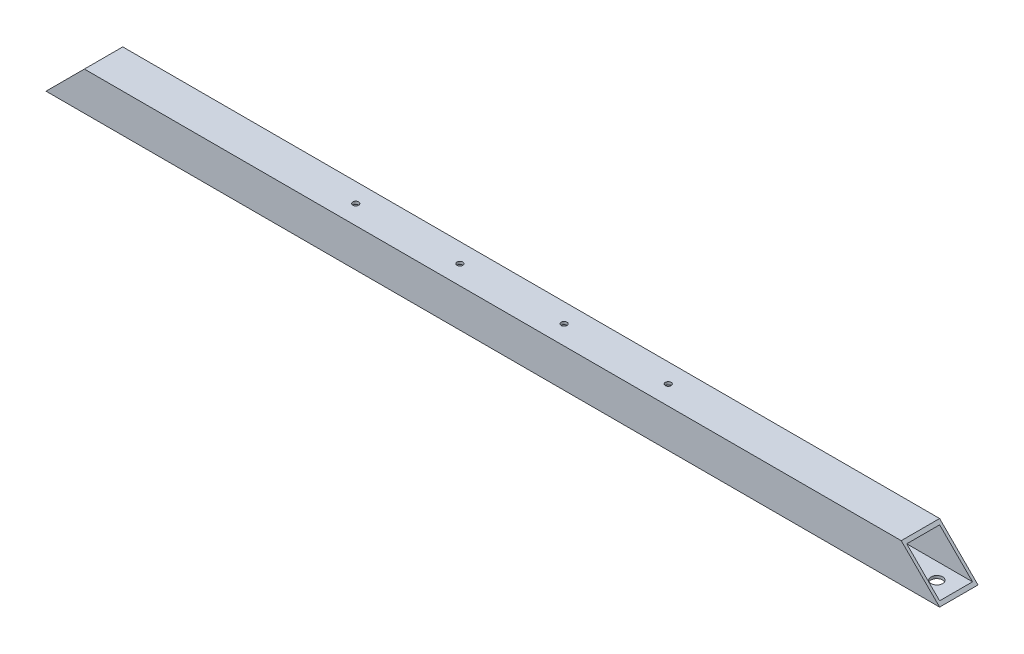
ISO-10303-21;
HEADER;
FILE_DESCRIPTION(('STEP AP214'),'2;1');
FILE_NAME('part.step','',(''),(''),'','','');
FILE_SCHEMA(('AUTOMOTIVE_DESIGN { 1 0 10303 214 1 1 1 1 }'));
ENDSEC;
DATA;
#1=APPLICATION_CONTEXT('core data for automotive mechanical design processes');
#2=APPLICATION_PROTOCOL_DEFINITION('international standard','automotive_design',2000,#1);
#3=PRODUCT_CONTEXT('',#1,'mechanical');
#4=PRODUCT('Part','Part','',(#3));
#5=PRODUCT_RELATED_PRODUCT_CATEGORY('part','',(#4));
#6=PRODUCT_DEFINITION_FORMATION('','',#4);
#7=PRODUCT_DEFINITION_CONTEXT('part definition',#1,'design');
#8=PRODUCT_DEFINITION('design','',#6,#7);
#9=PRODUCT_DEFINITION_SHAPE('','',#8);
#10=(LENGTH_UNIT() NAMED_UNIT(*) SI_UNIT(.MILLI.,.METRE.));
#11=(NAMED_UNIT(*) PLANE_ANGLE_UNIT() SI_UNIT($,.RADIAN.));
#12=(NAMED_UNIT(*) SI_UNIT($,.STERADIAN.) SOLID_ANGLE_UNIT());
#13=UNCERTAINTY_MEASURE_WITH_UNIT(LENGTH_MEASURE(1.E-05),#10,'distance_accuracy_value','');
#14=(GEOMETRIC_REPRESENTATION_CONTEXT(3) GLOBAL_UNCERTAINTY_ASSIGNED_CONTEXT((#13)) GLOBAL_UNIT_ASSIGNED_CONTEXT((#10,
#11,#12)) REPRESENTATION_CONTEXT('',''));
#15=CARTESIAN_POINT('',(0.,0.,0.));
#16=DIRECTION('',(0.,0.,1.));
#17=DIRECTION('',(1.,0.,0.));
#18=AXIS2_PLACEMENT_3D('',#15,#16,#17);
#19=CARTESIAN_POINT('',(1035.05,22.225,22.225));
#20=DIRECTION('',(0.,-1.,0.));
#21=DIRECTION('',(0.,0.,-1.));
#22=AXIS2_PLACEMENT_3D('',#19,#20,#21);
#23=PLANE('',#22);
#24=CARTESIAN_POINT('',(336.55,22.225,0.));
#25=DIRECTION('',(0.,1.,0.));
#26=DIRECTION('',(0.,0.,1.));
#27=AXIS2_PLACEMENT_3D('',#24,#25,#26);
#28=CIRCLE('',#27,3.3782);
#29=CARTESIAN_POINT('',(336.55,22.225,3.37820000000008));
#30=VERTEX_POINT('',#29);
#31=EDGE_CURVE('E453',#30,#30,#28,.T.);
#32=ORIENTED_EDGE('',*,*,#31,.F.);
#33=EDGE_LOOP('',(#32));
#34=FACE_BOUND('',#33,.T.);
#35=CARTESIAN_POINT('',(457.2,22.225,0.));
#36=DIRECTION('',(0.,1.,0.));
#37=DIRECTION('',(0.,0.,1.));
#38=AXIS2_PLACEMENT_3D('',#35,#36,#37);
#39=CIRCLE('',#38,3.3782);
#40=CARTESIAN_POINT('',(457.2,22.225,3.37820000000006));
#41=VERTEX_POINT('',#40);
#42=EDGE_CURVE('E156',#41,#41,#39,.T.);
#43=ORIENTED_EDGE('',*,*,#42,.F.);
#44=EDGE_LOOP('',(#43));
#45=FACE_BOUND('',#44,.T.);
#46=CARTESIAN_POINT('',(698.5,22.225,0.));
#47=DIRECTION('',(0.,1.,0.));
#48=DIRECTION('',(0.,0.,1.));
#49=AXIS2_PLACEMENT_3D('',#46,#47,#48);
#50=CIRCLE('',#49,3.3782);
#51=CARTESIAN_POINT('',(698.5,22.225,3.37820000000008));
#52=VERTEX_POINT('',#51);
#53=EDGE_CURVE('E180',#52,#52,#50,.T.);
#54=ORIENTED_EDGE('',*,*,#53,.F.);
#55=EDGE_LOOP('',(#54));
#56=FACE_BOUND('',#55,.T.);
#57=DIRECTION('',(-1.,0.,0.));
#58=VECTOR('',#57,1.);
#59=CARTESIAN_POINT('',(1035.05,22.225,-22.225));
#60=LINE('',#59,#58);
#61=CARTESIAN_POINT('',(990.6,22.225,-22.225));
#62=VERTEX_POINT('',#61);
#63=CARTESIAN_POINT('',(44.45,22.225,-22.225));
#64=VERTEX_POINT('',#63);
#65=EDGE_CURVE('E120',#62,#64,#60,.T.);
#66=ORIENTED_EDGE('',*,*,#65,.T.);
#67=DIRECTION('',(0.,0.,1.));
#68=VECTOR('',#67,1.);
#69=CARTESIAN_POINT('',(44.45,22.225,-22.225));
#70=LINE('',#69,#68);
#71=CARTESIAN_POINT('',(44.45,22.225,22.225));
#72=VERTEX_POINT('',#71);
#73=EDGE_CURVE('E103',#64,#72,#70,.T.);
#74=ORIENTED_EDGE('',*,*,#73,.T.);
#75=DIRECTION('',(-1.,0.,0.));
#76=VECTOR('',#75,1.);
#77=CARTESIAN_POINT('',(1035.05,22.225,22.225));
#78=LINE('',#77,#76);
#79=CARTESIAN_POINT('',(990.6,22.225,22.225));
#80=VERTEX_POINT('',#79);
#81=EDGE_CURVE('E128',#80,#72,#78,.T.);
#82=ORIENTED_EDGE('',*,*,#81,.F.);
#83=DIRECTION('',(0.,0.,1.));
#84=VECTOR('',#83,1.);
#85=CARTESIAN_POINT('',(990.6,22.225,-22.225));
#86=LINE('',#85,#84);
#87=EDGE_CURVE('E126',#62,#80,#86,.T.);
#88=ORIENTED_EDGE('',*,*,#87,.F.);
#89=EDGE_LOOP('',(#66,#74,#82,#88));
#90=FACE_BOUND('',#89,.T.);
#91=CARTESIAN_POINT('',(577.85,22.225,0.));
#92=DIRECTION('',(0.,1.,0.));
#93=DIRECTION('',(0.,0.,1.));
#94=AXIS2_PLACEMENT_3D('',#91,#92,#93);
#95=CIRCLE('',#94,3.3782);
#96=CARTESIAN_POINT('',(577.85,22.225,3.37820000000006));
#97=VERTEX_POINT('',#96);
#98=EDGE_CURVE('E152',#97,#97,#95,.T.);
#99=ORIENTED_EDGE('',*,*,#98,.F.);
#100=EDGE_LOOP('',(#99));
#101=FACE_BOUND('',#100,.T.);
#102=ADVANCED_FACE('F38',(#34,#45,#56,#90,#101),#23,.F.);
#103=CARTESIAN_POINT('',(1035.05,-22.225,22.225));
#104=DIRECTION('',(0.,1.,0.));
#105=DIRECTION('',(0.,0.,1.));
#106=AXIS2_PLACEMENT_3D('',#103,#104,#105);
#107=PLANE('',#106);
#108=CARTESIAN_POINT('',(336.55,-22.225,0.));
#109=DIRECTION('',(0.,1.,0.));
#110=DIRECTION('',(0.,0.,1.));
#111=AXIS2_PLACEMENT_3D('',#108,#109,#110);
#112=CIRCLE('',#111,3.3782);
#113=CARTESIAN_POINT('',(336.55,-22.225,3.37820000000008));
#114=VERTEX_POINT('',#113);
#115=EDGE_CURVE('E454',#114,#114,#112,.T.);
#116=ORIENTED_EDGE('',*,*,#115,.T.);
#117=EDGE_LOOP('',(#116));
#118=FACE_BOUND('',#117,.T.);
#119=CARTESIAN_POINT('',(457.2,-22.225,0.));
#120=DIRECTION('',(0.,1.,0.));
#121=DIRECTION('',(0.,0.,1.));
#122=AXIS2_PLACEMENT_3D('',#119,#120,#121);
#123=CIRCLE('',#122,3.3782);
#124=CARTESIAN_POINT('',(457.2,-22.225,3.37820000000006));
#125=VERTEX_POINT('',#124);
#126=EDGE_CURVE('E145',#125,#125,#123,.T.);
#127=ORIENTED_EDGE('',*,*,#126,.T.);
#128=EDGE_LOOP('',(#127));
#129=FACE_BOUND('',#128,.T.);
#130=CARTESIAN_POINT('',(577.85,-22.225,0.));
#131=DIRECTION('',(0.,1.,0.));
#132=DIRECTION('',(0.,0.,1.));
#133=AXIS2_PLACEMENT_3D('',#130,#131,#132);
#134=CIRCLE('',#133,3.3782);
#135=CARTESIAN_POINT('',(577.85,-22.225,3.37820000000006));
#136=VERTEX_POINT('',#135);
#137=EDGE_CURVE('E169',#136,#136,#134,.T.);
#138=ORIENTED_EDGE('',*,*,#137,.T.);
#139=EDGE_LOOP('',(#138));
#140=FACE_BOUND('',#139,.T.);
#141=CARTESIAN_POINT('',(698.5,-22.225,0.));
#142=DIRECTION('',(0.,1.,0.));
#143=DIRECTION('',(0.,0.,1.));
#144=AXIS2_PLACEMENT_3D('',#141,#142,#143);
#145=CIRCLE('',#144,3.3782);
#146=CARTESIAN_POINT('',(698.5,-22.225,3.37820000000008));
#147=VERTEX_POINT('',#146);
#148=EDGE_CURVE('E183',#147,#147,#145,.T.);
#149=ORIENTED_EDGE('',*,*,#148,.T.);
#150=EDGE_LOOP('',(#149));
#151=FACE_BOUND('',#150,.T.);
#152=CARTESIAN_POINT('',(25.4,-22.225,0.));
#153=DIRECTION('',(0.,-1.,0.));
#154=DIRECTION('',(0.,0.,-1.));
#155=AXIS2_PLACEMENT_3D('',#152,#153,#154);
#156=CIRCLE('',#155,6.74624);
#157=CARTESIAN_POINT('',(25.4,-22.225,-6.74623999999999));
#158=VERTEX_POINT('',#157);
#159=EDGE_CURVE('E140',#158,#158,#156,.T.);
#160=ORIENTED_EDGE('',*,*,#159,.F.);
#161=EDGE_LOOP('',(#160));
#162=FACE_BOUND('',#161,.T.);
#163=DIRECTION('',(0.,0.,-1.));
#164=VECTOR('',#163,1.);
#165=CARTESIAN_POINT('',(0.,-22.225,22.225));
#166=LINE('',#165,#164);
#167=CARTESIAN_POINT('',(0.,-22.225,22.225));
#168=VERTEX_POINT('',#167);
#169=CARTESIAN_POINT('',(0.,-22.225,-22.225));
#170=VERTEX_POINT('',#169);
#171=EDGE_CURVE('E229',#168,#170,#166,.T.);
#172=ORIENTED_EDGE('',*,*,#171,.T.);
#173=DIRECTION('',(-1.,0.,0.));
#174=VECTOR('',#173,1.);
#175=CARTESIAN_POINT('',(1035.05,-22.225,-22.225));
#176=LINE('',#175,#174);
#177=CARTESIAN_POINT('',(1035.05,-22.225,-22.225));
#178=VERTEX_POINT('',#177);
#179=EDGE_CURVE('E122',#178,#170,#176,.T.);
#180=ORIENTED_EDGE('',*,*,#179,.F.);
#181=DIRECTION('',(0.,0.,-1.));
#182=VECTOR('',#181,1.);
#183=CARTESIAN_POINT('',(1035.05,-22.225,22.225));
#184=LINE('',#183,#182);
#185=CARTESIAN_POINT('',(1035.05,-22.225,22.225));
#186=VERTEX_POINT('',#185);
#187=EDGE_CURVE('E230',#186,#178,#184,.T.);
#188=ORIENTED_EDGE('',*,*,#187,.F.);
#189=DIRECTION('',(-1.,0.,0.));
#190=VECTOR('',#189,1.);
#191=CARTESIAN_POINT('',(1035.05,-22.225,22.225));
#192=LINE('',#191,#190);
#193=EDGE_CURVE('E133',#186,#168,#192,.T.);
#194=ORIENTED_EDGE('',*,*,#193,.T.);
#195=EDGE_LOOP('',(#172,#180,#188,#194));
#196=FACE_BOUND('',#195,.T.);
#197=CARTESIAN_POINT('',(1009.65,-22.225,1.24005308158032E-13));
#198=DIRECTION('',(0.,-1.,0.));
#199=DIRECTION('',(0.,0.,-1.));
#200=AXIS2_PLACEMENT_3D('',#197,#198,#199);
#201=CIRCLE('',#200,6.74624000000001);
#202=CARTESIAN_POINT('',(1009.65,-22.225,-6.74623999999989));
#203=VERTEX_POINT('',#202);
#204=EDGE_CURVE('E139',#203,#203,#201,.T.);
#205=ORIENTED_EDGE('',*,*,#204,.F.);
#206=EDGE_LOOP('',(#205));
#207=FACE_BOUND('',#206,.T.);
#208=ADVANCED_FACE('F238',(#118,#129,#140,#151,#162,#196,#207),#107,.F.);
#209=CARTESIAN_POINT('',(1035.05,-19.05,19.05));
#210=DIRECTION('',(0.,0.,-1.));
#211=DIRECTION('',(-1.,0.,0.));
#212=AXIS2_PLACEMENT_3D('',#209,#210,#211);
#213=PLANE('',#212);
#214=DIRECTION('',(-0.707106781186548,-0.707106781186548,0.));
#215=VECTOR('',#214,1.);
#216=CARTESIAN_POINT('',(519.1125,496.8875,19.05));
#217=LINE('',#216,#215);
#218=CARTESIAN_POINT('',(41.2750000000003,19.05,19.05));
#219=VERTEX_POINT('',#218);
#220=CARTESIAN_POINT('',(3.17500000000015,-19.05,19.05));
#221=VERTEX_POINT('',#220);
#222=EDGE_CURVE('E11',#219,#221,#217,.T.);
#223=ORIENTED_EDGE('',*,*,#222,.F.);
#224=DIRECTION('',(-1.,0.,0.));
#225=VECTOR('',#224,1.);
#226=CARTESIAN_POINT('',(1035.05,19.05,19.05));
#227=LINE('',#226,#225);
#228=CARTESIAN_POINT('',(993.775,19.05,19.05));
#229=VERTEX_POINT('',#228);
#230=EDGE_CURVE('E218',#229,#219,#227,.T.);
#231=ORIENTED_EDGE('',*,*,#230,.F.);
#232=DIRECTION('',(-0.707106781186547,0.707106781186548,0.));
#233=VECTOR('',#232,1.);
#234=CARTESIAN_POINT('',(1033.4625,-20.6375,19.05));
#235=LINE('',#234,#233);
#236=CARTESIAN_POINT('',(1031.875,-19.05,19.05));
#237=VERTEX_POINT('',#236);
#238=EDGE_CURVE('E47',#237,#229,#235,.T.);
#239=ORIENTED_EDGE('',*,*,#238,.F.);
#240=DIRECTION('',(-1.,0.,0.));
#241=VECTOR('',#240,1.);
#242=CARTESIAN_POINT('',(1035.05,-19.05,19.05));
#243=LINE('',#242,#241);
#244=EDGE_CURVE('E214',#237,#221,#243,.T.);
#245=ORIENTED_EDGE('',*,*,#244,.T.);
#246=EDGE_LOOP('',(#223,#231,#239,#245));
#247=FACE_BOUND('',#246,.T.);
#248=ADVANCED_FACE('F262',(#247),#213,.T.);
#249=CARTESIAN_POINT('',(1035.05,19.05,19.05));
#250=DIRECTION('',(0.,-1.,0.));
#251=DIRECTION('',(0.,0.,-1.));
#252=AXIS2_PLACEMENT_3D('',#249,#250,#251);
#253=PLANE('',#252);
#254=CARTESIAN_POINT('',(336.55,19.05,0.));
#255=DIRECTION('',(0.,-1.,0.));
#256=DIRECTION('',(0.,0.,-1.));
#257=AXIS2_PLACEMENT_3D('',#254,#255,#256);
#258=CIRCLE('',#257,3.3782);
#259=CARTESIAN_POINT('',(336.55,19.05,-3.37819999999992));
#260=VERTEX_POINT('',#259);
#261=EDGE_CURVE('E163',#260,#260,#258,.T.);
#262=ORIENTED_EDGE('',*,*,#261,.F.);
#263=EDGE_LOOP('',(#262));
#264=FACE_BOUND('',#263,.T.);
#265=CARTESIAN_POINT('',(457.2,19.05,0.));
#266=DIRECTION('',(0.,-1.,0.));
#267=DIRECTION('',(0.,0.,-1.));
#268=AXIS2_PLACEMENT_3D('',#265,#266,#267);
#269=CIRCLE('',#268,3.3782);
#270=CARTESIAN_POINT('',(457.2,19.05,-3.37819999999993));
#271=VERTEX_POINT('',#270);
#272=EDGE_CURVE('E141',#271,#271,#269,.T.);
#273=ORIENTED_EDGE('',*,*,#272,.F.);
#274=EDGE_LOOP('',(#273));
#275=FACE_BOUND('',#274,.T.);
#276=CARTESIAN_POINT('',(577.85,19.05,0.));
#277=DIRECTION('',(0.,-1.,0.));
#278=DIRECTION('',(0.,0.,-1.));
#279=AXIS2_PLACEMENT_3D('',#276,#277,#278);
#280=CIRCLE('',#279,3.3782);
#281=CARTESIAN_POINT('',(577.85,19.05,-3.37819999999993));
#282=VERTEX_POINT('',#281);
#283=EDGE_CURVE('E176',#282,#282,#280,.T.);
#284=ORIENTED_EDGE('',*,*,#283,.F.);
#285=EDGE_LOOP('',(#284));
#286=FACE_BOUND('',#285,.T.);
#287=CARTESIAN_POINT('',(698.5,19.05,0.));
#288=DIRECTION('',(0.,-1.,0.));
#289=DIRECTION('',(0.,0.,-1.));
#290=AXIS2_PLACEMENT_3D('',#287,#288,#289);
#291=CIRCLE('',#290,3.3782);
#292=CARTESIAN_POINT('',(698.5,19.05,-3.37819999999992));
#293=VERTEX_POINT('',#292);
#294=EDGE_CURVE('E186',#293,#293,#291,.T.);
#295=ORIENTED_EDGE('',*,*,#294,.F.);
#296=EDGE_LOOP('',(#295));
#297=FACE_BOUND('',#296,.T.);
#298=DIRECTION('',(0.,0.,1.));
#299=VECTOR('',#298,1.);
#300=CARTESIAN_POINT('',(41.2750000000001,19.05,19.0499999999999));
#301=LINE('',#300,#299);
#302=CARTESIAN_POINT('',(41.2750000000001,19.05,-19.05));
#303=VERTEX_POINT('',#302);
#304=EDGE_CURVE('E62',#303,#219,#301,.T.);
#305=ORIENTED_EDGE('',*,*,#304,.F.);
#306=DIRECTION('',(-1.,0.,0.));
#307=VECTOR('',#306,1.);
#308=CARTESIAN_POINT('',(1035.05,19.05,-19.05));
#309=LINE('',#308,#307);
#310=CARTESIAN_POINT('',(993.775,19.05,-19.05));
#311=VERTEX_POINT('',#310);
#312=EDGE_CURVE('E222',#311,#303,#309,.T.);
#313=ORIENTED_EDGE('',*,*,#312,.F.);
#314=DIRECTION('',(0.,0.,-1.));
#315=VECTOR('',#314,1.);
#316=CARTESIAN_POINT('',(993.775,19.05,19.05));
#317=LINE('',#316,#315);
#318=EDGE_CURVE('E114',#229,#311,#317,.T.);
#319=ORIENTED_EDGE('',*,*,#318,.F.);
#320=ORIENTED_EDGE('',*,*,#230,.T.);
#321=EDGE_LOOP('',(#305,#313,#319,#320));
#322=FACE_BOUND('',#321,.T.);
#323=ADVANCED_FACE('F273',(#264,#275,#286,#297,#322),#253,.T.);
#324=CARTESIAN_POINT('',(1035.05,-19.05,-19.05));
#325=DIRECTION('',(0.,0.,1.));
#326=DIRECTION('',(0.,-1.,0.));
#327=AXIS2_PLACEMENT_3D('',#324,#325,#326);
#328=PLANE('',#327);
#329=DIRECTION('',(0.707106781186548,0.707106781186548,0.));
#330=VECTOR('',#329,1.);
#331=CARTESIAN_POINT('',(519.1125,496.8875,-19.0500000000001));
#332=LINE('',#331,#330);
#333=CARTESIAN_POINT('',(3.17500000000015,-19.05,-19.05));
#334=VERTEX_POINT('',#333);
#335=EDGE_CURVE('E210',#334,#303,#332,.T.);
#336=ORIENTED_EDGE('',*,*,#335,.F.);
#337=DIRECTION('',(-1.,0.,0.));
#338=VECTOR('',#337,1.);
#339=CARTESIAN_POINT('',(1035.05,-19.05,-19.05));
#340=LINE('',#339,#338);
#341=CARTESIAN_POINT('',(1031.875,-19.05,-19.05));
#342=VERTEX_POINT('',#341);
#343=EDGE_CURVE('E225',#342,#334,#340,.T.);
#344=ORIENTED_EDGE('',*,*,#343,.F.);
#345=DIRECTION('',(0.707106781186547,-0.707106781186548,0.));
#346=VECTOR('',#345,1.);
#347=CARTESIAN_POINT('',(1033.4625,-20.6375,-19.05));
#348=LINE('',#347,#346);
#349=EDGE_CURVE('E206',#311,#342,#348,.T.);
#350=ORIENTED_EDGE('',*,*,#349,.F.);
#351=ORIENTED_EDGE('',*,*,#312,.T.);
#352=EDGE_LOOP('',(#336,#344,#350,#351));
#353=FACE_BOUND('',#352,.T.);
#354=ADVANCED_FACE('F253',(#353),#328,.T.);
#355=CARTESIAN_POINT('',(1035.05,-19.05,19.05));
#356=DIRECTION('',(0.,1.,0.));
#357=DIRECTION('',(0.,0.,1.));
#358=AXIS2_PLACEMENT_3D('',#355,#356,#357);
#359=PLANE('',#358);
#360=CARTESIAN_POINT('',(336.55,-19.05,0.));
#361=DIRECTION('',(0.,1.,0.));
#362=DIRECTION('',(0.,0.,1.));
#363=AXIS2_PLACEMENT_3D('',#360,#361,#362);
#364=CIRCLE('',#363,3.3782);
#365=CARTESIAN_POINT('',(336.55,-19.05,3.37820000000008));
#366=VERTEX_POINT('',#365);
#367=EDGE_CURVE('E42',#366,#366,#364,.T.);
#368=ORIENTED_EDGE('',*,*,#367,.F.);
#369=EDGE_LOOP('',(#368));
#370=FACE_BOUND('',#369,.T.);
#371=CARTESIAN_POINT('',(457.2,-19.05,0.));
#372=DIRECTION('',(0.,1.,0.));
#373=DIRECTION('',(0.,0.,1.));
#374=AXIS2_PLACEMENT_3D('',#371,#372,#373);
#375=CIRCLE('',#374,3.3782);
#376=CARTESIAN_POINT('',(457.2,-19.05,3.37820000000006));
#377=VERTEX_POINT('',#376);
#378=EDGE_CURVE('E144',#377,#377,#375,.T.);
#379=ORIENTED_EDGE('',*,*,#378,.F.);
#380=EDGE_LOOP('',(#379));
#381=FACE_BOUND('',#380,.T.);
#382=CARTESIAN_POINT('',(577.85,-19.05,0.));
#383=DIRECTION('',(0.,1.,0.));
#384=DIRECTION('',(0.,0.,1.));
#385=AXIS2_PLACEMENT_3D('',#382,#383,#384);
#386=CIRCLE('',#385,3.3782);
#387=CARTESIAN_POINT('',(577.85,-19.05,3.37820000000006));
#388=VERTEX_POINT('',#387);
#389=EDGE_CURVE('E173',#388,#388,#386,.T.);
#390=ORIENTED_EDGE('',*,*,#389,.F.);
#391=EDGE_LOOP('',(#390));
#392=FACE_BOUND('',#391,.T.);
#393=CARTESIAN_POINT('',(698.5,-19.05,0.));
#394=DIRECTION('',(0.,1.,0.));
#395=DIRECTION('',(0.,0.,1.));
#396=AXIS2_PLACEMENT_3D('',#393,#394,#395);
#397=CIRCLE('',#396,3.3782);
#398=CARTESIAN_POINT('',(698.5,-19.05,3.37820000000008));
#399=VERTEX_POINT('',#398);
#400=EDGE_CURVE('E189',#399,#399,#397,.T.);
#401=ORIENTED_EDGE('',*,*,#400,.F.);
#402=EDGE_LOOP('',(#401));
#403=FACE_BOUND('',#402,.T.);
#404=CARTESIAN_POINT('',(25.4,-19.05,0.));
#405=DIRECTION('',(0.,1.,0.));
#406=DIRECTION('',(0.,0.,1.));
#407=AXIS2_PLACEMENT_3D('',#404,#405,#406);
#408=CIRCLE('',#407,6.74623999999999);
#409=CARTESIAN_POINT('',(25.4,-19.05,6.74624));
#410=VERTEX_POINT('',#409);
#411=EDGE_CURVE('E137',#410,#410,#408,.T.);
#412=ORIENTED_EDGE('',*,*,#411,.F.);
#413=EDGE_LOOP('',(#412));
#414=FACE_BOUND('',#413,.T.);
#415=CARTESIAN_POINT('',(1009.65,-19.05,1.24005308158032E-13));
#416=DIRECTION('',(0.,1.,0.));
#417=DIRECTION('',(0.,0.,1.));
#418=AXIS2_PLACEMENT_3D('',#415,#416,#417);
#419=CIRCLE('',#418,6.74624000000001);
#420=CARTESIAN_POINT('',(1009.65,-19.05,6.74624000000014));
#421=VERTEX_POINT('',#420);
#422=EDGE_CURVE('E196',#421,#421,#419,.T.);
#423=ORIENTED_EDGE('',*,*,#422,.F.);
#424=EDGE_LOOP('',(#423));
#425=FACE_BOUND('',#424,.T.);
#426=DIRECTION('',(0.,0.,-1.));
#427=VECTOR('',#426,1.);
#428=CARTESIAN_POINT('',(3.17499999999993,-19.05,19.05));
#429=LINE('',#428,#427);
#430=EDGE_CURVE('E212',#221,#334,#429,.T.);
#431=ORIENTED_EDGE('',*,*,#430,.F.);
#432=ORIENTED_EDGE('',*,*,#244,.F.);
#433=DIRECTION('',(0.,0.,1.));
#434=VECTOR('',#433,1.);
#435=CARTESIAN_POINT('',(1031.875,-19.05,19.05));
#436=LINE('',#435,#434);
#437=EDGE_CURVE('E55',#342,#237,#436,.T.);
#438=ORIENTED_EDGE('',*,*,#437,.F.);
#439=ORIENTED_EDGE('',*,*,#343,.T.);
#440=EDGE_LOOP('',(#431,#432,#438,#439));
#441=FACE_BOUND('',#440,.T.);
#442=ADVANCED_FACE('F246',(#370,#381,#392,#403,#414,#425,#441),#359,.T.);
#443=CARTESIAN_POINT('',(1035.05,-22.225,-22.225));
#444=DIRECTION('',(-0.707106781186548,-0.707106781186547,0.));
#445=DIRECTION('',(0.707106781186547,-0.707106781186548,0.));
#446=AXIS2_PLACEMENT_3D('',#443,#444,#445);
#447=PLANE('',#446);
#448=ORIENTED_EDGE('',*,*,#437,.T.);
#449=ORIENTED_EDGE('',*,*,#238,.T.);
#450=ORIENTED_EDGE('',*,*,#318,.T.);
#451=ORIENTED_EDGE('',*,*,#349,.T.);
#452=EDGE_LOOP('',(#448,#449,#450,#451));
#453=FACE_BOUND('',#452,.T.);
#454=DIRECTION('',(0.707106781186547,-0.707106781186548,0.));
#455=VECTOR('',#454,1.);
#456=CARTESIAN_POINT('',(1035.05,-22.225,22.225));
#457=LINE('',#456,#455);
#458=EDGE_CURVE('E198',#80,#186,#457,.T.);
#459=ORIENTED_EDGE('',*,*,#458,.T.);
#460=ORIENTED_EDGE('',*,*,#187,.T.);
#461=DIRECTION('',(0.707106781186547,-0.707106781186548,0.));
#462=VECTOR('',#461,1.);
#463=CARTESIAN_POINT('',(1035.05,-22.225,-22.225));
#464=LINE('',#463,#462);
#465=EDGE_CURVE('E201',#62,#178,#464,.T.);
#466=ORIENTED_EDGE('',*,*,#465,.F.);
#467=ORIENTED_EDGE('',*,*,#87,.T.);
#468=EDGE_LOOP('',(#459,#460,#466,#467));
#469=FACE_BOUND('',#468,.T.);
#470=ADVANCED_FACE('F244',(#453,#469),#447,.F.);
#471=CARTESIAN_POINT('',(0.,-22.225,-22.225));
#472=DIRECTION('',(0.707106781186547,-0.707106781186547,0.));
#473=DIRECTION('',(0.707106781186548,0.707106781186548,0.));
#474=AXIS2_PLACEMENT_3D('',#471,#472,#473);
#475=PLANE('',#474);
#476=ORIENTED_EDGE('',*,*,#430,.T.);
#477=ORIENTED_EDGE('',*,*,#335,.T.);
#478=ORIENTED_EDGE('',*,*,#304,.T.);
#479=ORIENTED_EDGE('',*,*,#222,.T.);
#480=EDGE_LOOP('',(#476,#477,#478,#479));
#481=FACE_BOUND('',#480,.T.);
#482=DIRECTION('',(0.707106781186547,0.707106781186548,0.));
#483=VECTOR('',#482,1.);
#484=CARTESIAN_POINT('',(0.,-22.225,22.225));
#485=LINE('',#484,#483);
#486=EDGE_CURVE('E109',#168,#72,#485,.T.);
#487=ORIENTED_EDGE('',*,*,#486,.T.);
#488=ORIENTED_EDGE('',*,*,#73,.F.);
#489=DIRECTION('',(0.707106781186547,0.707106781186548,0.));
#490=VECTOR('',#489,1.);
#491=CARTESIAN_POINT('',(0.,-22.225,-22.225));
#492=LINE('',#491,#490);
#493=EDGE_CURVE('E106',#170,#64,#492,.T.);
#494=ORIENTED_EDGE('',*,*,#493,.F.);
#495=ORIENTED_EDGE('',*,*,#171,.F.);
#496=EDGE_LOOP('',(#487,#488,#494,#495));
#497=FACE_BOUND('',#496,.T.);
#498=ADVANCED_FACE('F105',(#481,#497),#475,.F.);
#499=CARTESIAN_POINT('',(1035.05,-22.225,-22.225));
#500=DIRECTION('',(0.,0.,1.));
#501=DIRECTION('',(1.,0.,0.));
#502=AXIS2_PLACEMENT_3D('',#499,#500,#501);
#503=PLANE('',#502);
#504=ORIENTED_EDGE('',*,*,#179,.T.);
#505=ORIENTED_EDGE('',*,*,#493,.T.);
#506=ORIENTED_EDGE('',*,*,#65,.F.);
#507=ORIENTED_EDGE('',*,*,#465,.T.);
#508=EDGE_LOOP('',(#504,#505,#506,#507));
#509=FACE_BOUND('',#508,.T.);
#510=ADVANCED_FACE('F40',(#509),#503,.F.);
#511=CARTESIAN_POINT('',(1035.05,-22.225,22.225));
#512=DIRECTION('',(0.,0.,-1.));
#513=DIRECTION('',(-1.,0.,0.));
#514=AXIS2_PLACEMENT_3D('',#511,#512,#513);
#515=PLANE('',#514);
#516=ORIENTED_EDGE('',*,*,#81,.T.);
#517=ORIENTED_EDGE('',*,*,#486,.F.);
#518=ORIENTED_EDGE('',*,*,#193,.F.);
#519=ORIENTED_EDGE('',*,*,#458,.F.);
#520=EDGE_LOOP('',(#516,#517,#518,#519));
#521=FACE_BOUND('',#520,.T.);
#522=ADVANCED_FACE('F242',(#521),#515,.F.);
#523=CARTESIAN_POINT('',(1009.65,-22.225,1.24005308158032E-13));
#524=DIRECTION('',(0.,-1.,0.));
#525=DIRECTION('',(0.,0.,-1.));
#526=AXIS2_PLACEMENT_3D('',#523,#524,#525);
#527=CYLINDRICAL_SURFACE('',#526,6.74624000000001);
#528=ORIENTED_EDGE('',*,*,#422,.T.);
#529=EDGE_LOOP('',(#528));
#530=FACE_BOUND('',#529,.T.);
#531=ORIENTED_EDGE('',*,*,#204,.T.);
#532=EDGE_LOOP('',(#531));
#533=FACE_BOUND('',#532,.T.);
#534=ADVANCED_FACE('F269',(#530,#533),#527,.F.);
#535=CARTESIAN_POINT('',(25.4,-22.225,0.));
#536=DIRECTION('',(0.,-1.,0.));
#537=DIRECTION('',(0.,0.,-1.));
#538=AXIS2_PLACEMENT_3D('',#535,#536,#537);
#539=CYLINDRICAL_SURFACE('',#538,6.74623999999999);
#540=ORIENTED_EDGE('',*,*,#411,.T.);
#541=EDGE_LOOP('',(#540));
#542=FACE_BOUND('',#541,.T.);
#543=ORIENTED_EDGE('',*,*,#159,.T.);
#544=EDGE_LOOP('',(#543));
#545=FACE_BOUND('',#544,.T.);
#546=ADVANCED_FACE('F317',(#542,#545),#539,.F.);
#547=CARTESIAN_POINT('',(698.5,22.225,0.));
#548=DIRECTION('',(0.,1.,0.));
#549=DIRECTION('',(0.,0.,1.));
#550=AXIS2_PLACEMENT_3D('',#547,#548,#549);
#551=CYLINDRICAL_SURFACE('',#550,3.3782);
#552=ORIENTED_EDGE('',*,*,#294,.T.);
#553=EDGE_LOOP('',(#552));
#554=FACE_BOUND('',#553,.T.);
#555=ORIENTED_EDGE('',*,*,#53,.T.);
#556=EDGE_LOOP('',(#555));
#557=FACE_BOUND('',#556,.T.);
#558=ADVANCED_FACE('F311',(#554,#557),#551,.F.);
#559=ORIENTED_EDGE('',*,*,#400,.T.);
#560=EDGE_LOOP('',(#559));
#561=FACE_BOUND('',#560,.T.);
#562=ORIENTED_EDGE('',*,*,#148,.F.);
#563=EDGE_LOOP('',(#562));
#564=FACE_BOUND('',#563,.T.);
#565=ADVANCED_FACE('F316',(#561,#564),#551,.F.);
#566=CARTESIAN_POINT('',(577.85,22.225,0.));
#567=DIRECTION('',(0.,1.,0.));
#568=DIRECTION('',(0.,0.,1.));
#569=AXIS2_PLACEMENT_3D('',#566,#567,#568);
#570=CYLINDRICAL_SURFACE('',#569,3.3782);
#571=ORIENTED_EDGE('',*,*,#283,.T.);
#572=EDGE_LOOP('',(#571));
#573=FACE_BOUND('',#572,.T.);
#574=ORIENTED_EDGE('',*,*,#98,.T.);
#575=EDGE_LOOP('',(#574));
#576=FACE_BOUND('',#575,.T.);
#577=ADVANCED_FACE('F329',(#573,#576),#570,.F.);
#578=ORIENTED_EDGE('',*,*,#389,.T.);
#579=EDGE_LOOP('',(#578));
#580=FACE_BOUND('',#579,.T.);
#581=ORIENTED_EDGE('',*,*,#137,.F.);
#582=EDGE_LOOP('',(#581));
#583=FACE_BOUND('',#582,.T.);
#584=ADVANCED_FACE('F338',(#580,#583),#570,.F.);
#585=CARTESIAN_POINT('',(457.2,22.225,0.));
#586=DIRECTION('',(0.,1.,0.));
#587=DIRECTION('',(0.,0.,1.));
#588=AXIS2_PLACEMENT_3D('',#585,#586,#587);
#589=CYLINDRICAL_SURFACE('',#588,3.3782);
#590=ORIENTED_EDGE('',*,*,#272,.T.);
#591=EDGE_LOOP('',(#590));
#592=FACE_BOUND('',#591,.T.);
#593=ORIENTED_EDGE('',*,*,#42,.T.);
#594=EDGE_LOOP('',(#593));
#595=FACE_BOUND('',#594,.T.);
#596=ADVANCED_FACE('F348',(#592,#595),#589,.F.);
#597=ORIENTED_EDGE('',*,*,#378,.T.);
#598=EDGE_LOOP('',(#597));
#599=FACE_BOUND('',#598,.T.);
#600=ORIENTED_EDGE('',*,*,#126,.F.);
#601=EDGE_LOOP('',(#600));
#602=FACE_BOUND('',#601,.T.);
#603=ADVANCED_FACE('F357',(#599,#602),#589,.F.);
#604=CARTESIAN_POINT('',(336.55,22.225,0.));
#605=DIRECTION('',(0.,1.,0.));
#606=DIRECTION('',(0.,0.,1.));
#607=AXIS2_PLACEMENT_3D('',#604,#605,#606);
#608=CYLINDRICAL_SURFACE('',#607,3.3782);
#609=ORIENTED_EDGE('',*,*,#367,.T.);
#610=EDGE_LOOP('',(#609));
#611=FACE_BOUND('',#610,.T.);
#612=ORIENTED_EDGE('',*,*,#115,.F.);
#613=EDGE_LOOP('',(#612));
#614=FACE_BOUND('',#613,.T.);
#615=ADVANCED_FACE('F366',(#611,#614),#608,.F.);
#616=ORIENTED_EDGE('',*,*,#261,.T.);
#617=EDGE_LOOP('',(#616));
#618=FACE_BOUND('',#617,.T.);
#619=ORIENTED_EDGE('',*,*,#31,.T.);
#620=EDGE_LOOP('',(#619));
#621=FACE_BOUND('',#620,.T.);
#622=ADVANCED_FACE('F375',(#618,#621),#608,.F.);
#623=CLOSED_SHELL('',(#102,#208,#248,#323,#354,#442,#470,#498,#510,#522,#534,#546,#558,#565,
#577,#584,#596,#603,#615,#622));
#624=MANIFOLD_SOLID_BREP('B2',#623);
#625=ADVANCED_BREP_SHAPE_REPRESENTATION('',(#18,#624),#14);
#626=SHAPE_DEFINITION_REPRESENTATION(#9,#625);
ENDSEC;
END-ISO-10303-21;
